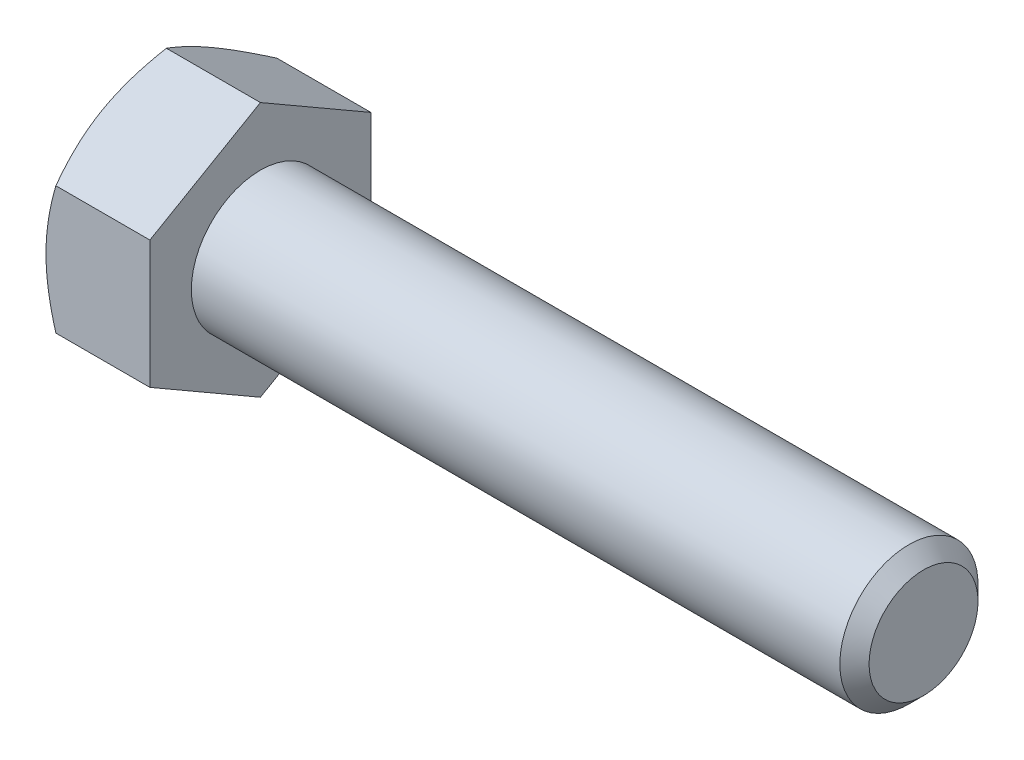
ISO-10303-21;
HEADER;
FILE_DESCRIPTION(('STEP AP214'),'2;1');
FILE_NAME('part.step','',(''),(''),'','','');
FILE_SCHEMA(('AUTOMOTIVE_DESIGN { 1 0 10303 214 1 1 1 1 }'));
ENDSEC;
DATA;
#1=APPLICATION_CONTEXT('core data for automotive mechanical design processes');
#2=APPLICATION_PROTOCOL_DEFINITION('international standard','automotive_design',2000,#1);
#3=PRODUCT_CONTEXT('',#1,'mechanical');
#4=PRODUCT('Part','Part','',(#3));
#5=PRODUCT_RELATED_PRODUCT_CATEGORY('part','',(#4));
#6=PRODUCT_DEFINITION_FORMATION('','',#4);
#7=PRODUCT_DEFINITION_CONTEXT('part definition',#1,'design');
#8=PRODUCT_DEFINITION('design','',#6,#7);
#9=PRODUCT_DEFINITION_SHAPE('','',#8);
#10=(LENGTH_UNIT() NAMED_UNIT(*) SI_UNIT(.MILLI.,.METRE.));
#11=(NAMED_UNIT(*) PLANE_ANGLE_UNIT() SI_UNIT($,.RADIAN.));
#12=(NAMED_UNIT(*) SI_UNIT($,.STERADIAN.) SOLID_ANGLE_UNIT());
#13=UNCERTAINTY_MEASURE_WITH_UNIT(LENGTH_MEASURE(1.E-05),#10,'distance_accuracy_value','');
#14=(GEOMETRIC_REPRESENTATION_CONTEXT(3) GLOBAL_UNCERTAINTY_ASSIGNED_CONTEXT((#13)) GLOBAL_UNIT_ASSIGNED_CONTEXT((#10,
#11,#12)) REPRESENTATION_CONTEXT('',''));
#15=CARTESIAN_POINT('',(0.,0.,0.));
#16=DIRECTION('',(0.,0.,1.));
#17=DIRECTION('',(1.,0.,0.));
#18=AXIS2_PLACEMENT_3D('',#15,#16,#17);
#19=CARTESIAN_POINT('',(5.969,3.66617420935412,-6.35));
#20=DIRECTION('',(0.,-0.866025403784438,0.500000000000001));
#21=DIRECTION('',(0.,-0.500000000000001,-0.866025403784438));
#22=AXIS2_PLACEMENT_3D('',#19,#20,#21);
#23=PLANE('',#22);
#24=CARTESIAN_POINT('',(0.567225792220654,7.33246388876209,0.000200000000000209));
#25=CARTESIAN_POINT('',(0.520705795885484,7.25187715009445,-0.13938032578862));
#26=CARTESIAN_POINT('',(0.476297032585866,7.17098994497989,-0.279481074729295));
#27=CARTESIAN_POINT('',(0.39228345045239,7.00855864282176,-0.560820342806734));
#28=CARTESIAN_POINT('',(0.352680703976118,6.92701427845871,-0.702059324954459));
#29=CARTESIAN_POINT('',(0.241858823809871,6.68107555195827,-1.12803769480199));
#30=CARTESIAN_POINT('',(0.178824482202446,6.51571038378533,-1.41445856787971));
#31=CARTESIAN_POINT('',(0.104909071695574,6.26824441683674,-1.84308219577883));
#32=CARTESIAN_POINT('',(0.0838526679332028,6.18688302502749,-1.98400426016695));
#33=CARTESIAN_POINT('',(0.0485440446617519,6.02379260806586,-2.26648514857209));
#34=CARTESIAN_POINT('',(0.0342912239672212,5.94206361604021,-2.40804391521192));
#35=CARTESIAN_POINT('',(0.012953004278083,5.77846368249352,-2.69140731222966));
#36=CARTESIAN_POINT('',(0.00585947102328989,5.69659300817866,-2.83321147979293));
#37=CARTESIAN_POINT('',(-0.0010156791714816,5.53278054688489,-3.11694298566665));
#38=CARTESIAN_POINT('',(-0.000797521989078706,5.45083876218097,-3.2588703200367));
#39=CARTESIAN_POINT('',(0.0098505765270565,5.22634399461133,-3.64770666350069));
#40=CARTESIAN_POINT('',(0.0277266404085338,5.08386449580427,-3.89448839447147));
#41=CARTESIAN_POINT('',(0.0844122058574266,4.79985183690217,-4.38641274968262));
#42=CARTESIAN_POINT('',(0.123241082865867,4.65831967566048,-4.63155364385826));
#43=CARTESIAN_POINT('',(0.220302170250008,4.37373542545027,-5.12446802425625));
#44=CARTESIAN_POINT('',(0.278945624959318,4.23071924628532,-5.37217931287431));
#45=CARTESIAN_POINT('',(0.412042668710683,3.94681968285054,-5.86390778098996));
#46=CARTESIAN_POINT('',(0.486464993107679,3.80593266266769,-6.10793125807364));
#47=CARTESIAN_POINT('',(0.567225792220648,3.66605873930028,-6.3502));
#48=B_SPLINE_CURVE_WITH_KNOTS('',3,(#24,#25,#26,#27,#28,#29,#30,#31,#32,#33,#34,#35,#36,#37,#38,
#39,#40,#41,#42,#43,#44,#45,#46,#47),.UNSPECIFIED.,.F.,.F.,(4,2,2,2,2,2,2,2,2,2,2,4),(0.,
0.503218195050232,1.00665261286994,2.01561339063536,2.50773694105499,2.99981699787609,
3.49133733019735,3.9828424781586,4.83850206575153,5.69495425638523,6.57040160519865,
7.44413026658513),.UNSPECIFIED.);
#49=CARTESIAN_POINT('',(0.567159123979209,7.33234841870825,0.));
#50=VERTEX_POINT('',#49);
#51=CARTESIAN_POINT('',(0.,5.49926131403118,-3.17500000000001));
#52=VERTEX_POINT('',#51);
#53=EDGE_CURVE('E50',#50,#52,#48,.T.);
#54=ORIENTED_EDGE('',*,*,#53,.F.);
#55=DIRECTION('',(-1.,0.,0.));
#56=VECTOR('',#55,1.);
#57=CARTESIAN_POINT('',(5.969,7.33234841870825,0.));
#58=LINE('',#57,#56);
#59=CARTESIAN_POINT('',(5.969,7.33234841870825,0.));
#60=VERTEX_POINT('',#59);
#61=EDGE_CURVE('E146',#60,#50,#58,.T.);
#62=ORIENTED_EDGE('',*,*,#61,.F.);
#63=DIRECTION('',(0.,0.500000000000001,0.866025403784438));
#64=VECTOR('',#63,1.);
#65=CARTESIAN_POINT('',(5.969,3.66617420935412,-6.35));
#66=LINE('',#65,#64);
#67=CARTESIAN_POINT('',(5.969,3.66617420935412,-6.35));
#68=VERTEX_POINT('',#67);
#69=EDGE_CURVE('E237',#68,#60,#66,.T.);
#70=ORIENTED_EDGE('',*,*,#69,.F.);
#71=DIRECTION('',(-1.,0.,0.));
#72=VECTOR('',#71,1.);
#73=CARTESIAN_POINT('',(5.969,3.66617420935412,-6.35));
#74=LINE('',#73,#72);
#75=CARTESIAN_POINT('',(0.567159123979204,3.66617420935412,-6.35));
#76=VERTEX_POINT('',#75);
#77=EDGE_CURVE('E134',#68,#76,#74,.T.);
#78=ORIENTED_EDGE('',*,*,#77,.T.);
#79=EDGE_CURVE('E128',#52,#76,#48,.T.);
#80=ORIENTED_EDGE('',*,*,#79,.F.);
#81=EDGE_LOOP('',(#54,#62,#70,#78,#80));
#82=FACE_BOUND('',#81,.T.);
#83=ADVANCED_FACE('F34',(#82),#23,.F.);
#84=CARTESIAN_POINT('',(5.969,7.33234841870825,0.));
#85=DIRECTION('',(0.,-0.866025403784438,-0.500000000000001));
#86=DIRECTION('',(0.,0.500000000000001,-0.866025403784438));
#87=AXIS2_PLACEMENT_3D('',#84,#85,#86);
#88=PLANE('',#87);
#89=CARTESIAN_POINT('',(0.56722579222065,3.66605873930028,6.3502));
#90=CARTESIAN_POINT('',(0.520705795885481,3.74664547796792,6.21061967421138));
#91=CARTESIAN_POINT('',(0.476297032585863,3.82753268308249,6.0705189252707));
#92=CARTESIAN_POINT('',(0.392283450452388,3.98996398524061,5.78917965719326));
#93=CARTESIAN_POINT('',(0.352680703976116,4.07150834960367,5.64794067504554));
#94=CARTESIAN_POINT('',(0.24185882380987,4.3174470761041,5.22196230519801));
#95=CARTESIAN_POINT('',(0.178824482202445,4.48281224427705,4.93554143212029));
#96=CARTESIAN_POINT('',(0.104909071695574,4.73027821122563,4.50691780422117));
#97=CARTESIAN_POINT('',(0.0838526679332024,4.81163960303488,4.36599573983305));
#98=CARTESIAN_POINT('',(0.0485440446617518,4.97473001999651,4.08351485142791));
#99=CARTESIAN_POINT('',(0.0342912239672212,5.05645901202216,3.94195608478808));
#100=CARTESIAN_POINT('',(0.0129530042780835,5.22005894556885,3.65859268777034));
#101=CARTESIAN_POINT('',(0.00585947102329078,5.30192961988371,3.51678852020707));
#102=CARTESIAN_POINT('',(-0.00101567917148024,5.46574208117748,3.23305701433335));
#103=CARTESIAN_POINT('',(-0.000797521989077285,5.54768386588139,3.0911296799633));
#104=CARTESIAN_POINT('',(0.00985057652705815,5.77217863345104,2.70229333649931));
#105=CARTESIAN_POINT('',(0.0277266404085357,5.9146581322581,2.45551160552853));
#106=CARTESIAN_POINT('',(0.084412205857429,6.19867079116019,1.96358725031738));
#107=CARTESIAN_POINT('',(0.12324108286587,6.34020295240189,1.71844635614174));
#108=CARTESIAN_POINT('',(0.220302170250012,6.6247872026121,1.22553197574375));
#109=CARTESIAN_POINT('',(0.278945624959322,6.76780338177705,0.977820687125687));
#110=CARTESIAN_POINT('',(0.412042668710687,7.05170294521182,0.486092219010034));
#111=CARTESIAN_POINT('',(0.486464993107684,7.19258996539467,0.242068741926357));
#112=CARTESIAN_POINT('',(0.567225792220653,7.33246388876209,-0.000200000000000381));
#113=B_SPLINE_CURVE_WITH_KNOTS('',3,(#89,#90,#91,#92,#93,#94,#95,#96,#97,#98,#99,#100,#101,#102,
#103,#104,#105,#106,#107,#108,#109,#110,#111,#112),.UNSPECIFIED.,.F.,.F.,(4,2,2,2,2,2,2,2,2,2,2,
4),(0.,0.503218195050233,1.00665261286994,2.01561339063536,2.50773694105499,2.99981699787608,
3.49133733019735,3.9828424781586,4.83850206575152,5.69495425638523,6.57040160519864,
7.44413026658513),.UNSPECIFIED.);
#114=CARTESIAN_POINT('',(0.567159123979205,3.66617420935412,6.35));
#115=VERTEX_POINT('',#114);
#116=CARTESIAN_POINT('',(0.,5.49926131403118,3.175));
#117=VERTEX_POINT('',#116);
#118=EDGE_CURVE('E57',#115,#117,#113,.T.);
#119=ORIENTED_EDGE('',*,*,#118,.F.);
#120=DIRECTION('',(-1.,0.,0.));
#121=VECTOR('',#120,1.);
#122=CARTESIAN_POINT('',(5.969,3.66617420935412,6.35));
#123=LINE('',#122,#121);
#124=CARTESIAN_POINT('',(5.969,3.66617420935412,6.35));
#125=VERTEX_POINT('',#124);
#126=EDGE_CURVE('E144',#125,#115,#123,.T.);
#127=ORIENTED_EDGE('',*,*,#126,.F.);
#128=DIRECTION('',(0.,-0.500000000000001,0.866025403784438));
#129=VECTOR('',#128,1.);
#130=CARTESIAN_POINT('',(5.969,7.33234841870825,0.));
#131=LINE('',#130,#129);
#132=EDGE_CURVE('E235',#60,#125,#131,.T.);
#133=ORIENTED_EDGE('',*,*,#132,.F.);
#134=ORIENTED_EDGE('',*,*,#61,.T.);
#135=EDGE_CURVE('E161',#117,#50,#113,.T.);
#136=ORIENTED_EDGE('',*,*,#135,.F.);
#137=EDGE_LOOP('',(#119,#127,#133,#134,#136));
#138=FACE_BOUND('',#137,.T.);
#139=ADVANCED_FACE('F167',(#138),#88,.F.);
#140=CARTESIAN_POINT('',(5.969,3.66617420935412,6.35));
#141=DIRECTION('',(0.,0.,-1.));
#142=DIRECTION('',(-1.,0.,0.));
#143=AXIS2_PLACEMENT_3D('',#140,#141,#142);
#144=PLANE('',#143);
#145=CARTESIAN_POINT('',(3.14367601755405,-9.9398028319864,6.35));
#146=CARTESIAN_POINT('',(3.00837198029773,-9.66163438687443,6.35));
#147=CARTESIAN_POINT('',(2.87433908027309,-9.38283710730511,6.35));
#148=CARTESIAN_POINT('',(2.60952879037524,-8.82365074911731,6.35));
#149=CARTESIAN_POINT('',(2.4787518963537,-8.54326143593898,6.35));
#150=CARTESIAN_POINT('',(2.22052868772129,-7.97915634696428,6.35));
#151=CARTESIAN_POINT('',(2.09310359186349,-7.695430825227,6.35));
#152=CARTESIAN_POINT('',(1.84334767414879,-7.12575465379769,6.35));
#153=CARTESIAN_POINT('',(1.72101661744909,-6.83980410740554,6.35));
#154=CARTESIAN_POINT('',(1.47885197386771,-6.2557230270762,6.35));
#155=CARTESIAN_POINT('',(1.35923464654653,-5.9575023498181,6.35));
#156=CARTESIAN_POINT('',(1.12883238942456,-5.357606094795,6.35));
#157=CARTESIAN_POINT('',(1.01804843752938,-5.05593013872691,6.35));
#158=CARTESIAN_POINT('',(0.808153098255226,-4.44917964545297,6.35));
#159=CARTESIAN_POINT('',(0.709018875842444,-4.14411308466491,6.35));
#160=CARTESIAN_POINT('',(0.525543834192885,-3.52960171995185,6.35));
#161=CARTESIAN_POINT('',(0.441198453590938,-3.22015829792944,6.35));
#162=CARTESIAN_POINT('',(0.291727586386877,-2.59842911342063,6.35));
#163=CARTESIAN_POINT('',(0.226496888329709,-2.2861690499431,6.35));
#164=CARTESIAN_POINT('',(0.118904571828102,-1.65762730788836,6.35));
#165=CARTESIAN_POINT('',(0.0765405573459597,-1.34134605421932,6.35));
#166=CARTESIAN_POINT('',(0.0329533459299356,-0.86727501688879,6.35));
#167=CARTESIAN_POINT('',(0.0217606490874794,-0.710363798925239,6.35));
#168=CARTESIAN_POINT('',(0.00601970866108338,-0.396201526465927,6.35));
#169=CARTESIAN_POINT('',(0.00147135206033238,-0.238950477796077,6.35));
#170=CARTESIAN_POINT('',(-0.000864873693704551,0.0756024820110096,6.35));
#171=CARTESIAN_POINT('',(0.00134730804231392,0.232904393522198,6.35));
#172=CARTESIAN_POINT('',(0.0124750937047343,0.547273259965608,6.35));
#173=CARTESIAN_POINT('',(0.0213910154873185,0.704340203403035,6.35));
#174=CARTESIAN_POINT('',(0.0504634057547397,1.07899586027898,6.35));
#175=CARTESIAN_POINT('',(0.0736436238822172,1.2963550957377,6.35));
#176=CARTESIAN_POINT('',(0.131599604348194,1.72951065205878,6.35));
#177=CARTESIAN_POINT('',(0.166376861833686,1.94530676772893,6.35));
#178=CARTESIAN_POINT('',(0.286264257854857,2.59006925980297,6.35));
#179=CARTESIAN_POINT('',(0.386910475193507,3.01618787228098,6.35));
#180=CARTESIAN_POINT('',(0.56211678462825,3.65361272982344,6.35));
#181=CARTESIAN_POINT('',(0.625415304913838,3.86820484032541,6.35));
#182=CARTESIAN_POINT('',(0.758751353425599,4.29530575657378,6.35));
#183=CARTESIAN_POINT('',(0.828788931820657,4.50781454679792,6.35));
#184=CARTESIAN_POINT('',(0.974465563814956,4.93081468737568,6.35));
#185=CARTESIAN_POINT('',(1.05010294252176,5.14130661986484,6.35));
#186=CARTESIAN_POINT('',(1.20607264760708,5.56053331579618,6.35));
#187=CARTESIAN_POINT('',(1.28640487799369,5.76926811506532,6.35));
#188=CARTESIAN_POINT('',(1.50347781751132,6.31783828344511,6.35));
#189=CARTESIAN_POINT('',(1.64351404320344,6.65636817400485,6.35));
#190=CARTESIAN_POINT('',(1.93147973510731,7.33006601753897,6.35));
#191=CARTESIAN_POINT('',(2.07940998438119,7.66523363305403,6.35));
#192=CARTESIAN_POINT('',(2.38134633815376,8.33295246114881,6.35));
#193=CARTESIAN_POINT('',(2.53535453751782,8.66550272340177,6.35));
#194=CARTESIAN_POINT('',(2.84803388547348,9.32838207907316,6.35));
#195=CARTESIAN_POINT('',(3.00670486567663,9.65871125217437,6.35));
#196=CARTESIAN_POINT('',(3.32795966755859,10.3180684957328,6.35));
#197=CARTESIAN_POINT('',(3.49054898052716,10.6470938852597,6.35));
#198=CARTESIAN_POINT('',(3.81866781799735,11.3036759425,6.35));
#199=CARTESIAN_POINT('',(3.98419736411603,11.6312325993929,6.35));
#200=CARTESIAN_POINT('',(4.31759864974134,12.2850676249536,6.35));
#201=CARTESIAN_POINT('',(4.485469913239,12.6113462366288,6.35));
#202=CARTESIAN_POINT('',(4.82315890277016,13.2628952011191,6.35));
#203=CARTESIAN_POINT('',(4.99297663652367,13.5881655499287,6.35));
#204=CARTESIAN_POINT('',(5.47018031685674,14.4967378639502,6.35));
#205=CARTESIAN_POINT('',(5.77935148177738,15.0791020152927,6.35));
#206=CARTESIAN_POINT('',(6.40147296847068,16.2418453877031,6.35));
#207=CARTESIAN_POINT('',(6.71442349983112,16.8222244963774,6.35));
#208=CARTESIAN_POINT('',(7.34215184678352,17.9796171047036,6.35));
#209=CARTESIAN_POINT('',(7.65692074956546,18.5566354431591,6.35));
#210=CARTESIAN_POINT('',(8.28862904640648,19.7094283212459,6.35));
#211=CARTESIAN_POINT('',(8.60556827976312,20.2852029489025,6.35));
#212=CARTESIAN_POINT('',(8.92329906980364,20.8605372016132,6.35));
#213=B_SPLINE_CURVE_WITH_KNOTS('',3,(#145,#146,#147,#148,#149,#150,#151,#152,#153,#154,#155,
#156,#157,#158,#159,#160,#161,#162,#163,#164,#165,#166,#167,#168,#169,#170,#171,#172,#173,#174,
#175,#176,#177,#178,#179,#180,#181,#182,#183,#184,#185,#186,#187,#188,#189,#190,#191,#192,#193,
#194,#195,#196,#197,#198,#199,#200,#201,#202,#203,#204,#205,#206,#207,#208,#209,#210,#211,#212),
.UNSPECIFIED.,.F.,.F.,(4,2,2,2,2,2,2,2,2,2,2,2,2,2,2,2,2,2,2,2,2,2,2,2,2,2,2,2,2,2,2,2,2,4),(0.,
0.928000025771649,1.85614052122796,2.78917912474405,3.72217466606164,4.68601414241723,
5.64996017364175,6.61198406033348,7.57371070325733,8.53003982946588,9.48626872926093,
9.95807916799837,10.4298815813894,10.9016875462366,11.3735158830582,12.0289230702765,
12.6844147884824,13.9960635141582,14.6672040909619,15.338349664455,16.0092953039748,
16.6802272299963,17.7791313314936,18.8781446441682,19.9775401158916,21.0768959334804,
22.1778940812193,23.2789003270287,24.379685937715,25.480475915801,27.4584871219283,
29.4366085285952,31.408472007269,33.380191024666),.UNSPECIFIED.);
#214=CARTESIAN_POINT('',(0.567159123979205,-3.66617420935412,6.35));
#215=VERTEX_POINT('',#214);
#216=CARTESIAN_POINT('',(0.,0.,6.35));
#217=VERTEX_POINT('',#216);
#218=EDGE_CURVE('E247',#215,#217,#213,.T.);
#219=ORIENTED_EDGE('',*,*,#218,.F.);
#220=DIRECTION('',(-1.,0.,0.));
#221=VECTOR('',#220,1.);
#222=CARTESIAN_POINT('',(5.969,-3.66617420935412,6.35));
#223=LINE('',#222,#221);
#224=CARTESIAN_POINT('',(5.969,-3.66617420935412,6.35));
#225=VERTEX_POINT('',#224);
#226=EDGE_CURVE('E136',#225,#215,#223,.T.);
#227=ORIENTED_EDGE('',*,*,#226,.F.);
#228=DIRECTION('',(0.,-1.,0.));
#229=VECTOR('',#228,1.);
#230=CARTESIAN_POINT('',(5.969,3.66617420935412,6.35));
#231=LINE('',#230,#229);
#232=EDGE_CURVE('E231',#125,#225,#231,.T.);
#233=ORIENTED_EDGE('',*,*,#232,.F.);
#234=ORIENTED_EDGE('',*,*,#126,.T.);
#235=EDGE_CURVE('E185',#217,#115,#213,.T.);
#236=ORIENTED_EDGE('',*,*,#235,.F.);
#237=EDGE_LOOP('',(#219,#227,#233,#234,#236));
#238=FACE_BOUND('',#237,.T.);
#239=ADVANCED_FACE('F253',(#238),#144,.F.);
#240=CARTESIAN_POINT('',(5.969,-7.33234841870826,0.));
#241=DIRECTION('',(0.,0.866025403784437,-0.500000000000002));
#242=DIRECTION('',(0.,0.500000000000002,0.866025403784438));
#243=AXIS2_PLACEMENT_3D('',#240,#241,#242);
#244=PLANE('',#243);
#245=CARTESIAN_POINT('',(0.56722579222066,-7.3324638887621,-0.000200000000000038));
#246=CARTESIAN_POINT('',(0.520705795885491,-7.25187715009446,0.13938032578862));
#247=CARTESIAN_POINT('',(0.476297032585872,-7.1709899449799,0.279481074729295));
#248=CARTESIAN_POINT('',(0.392283450452396,-7.00855864282177,0.560820342806735));
#249=CARTESIAN_POINT('',(0.352680703976124,-6.92701427845872,0.70205932495446));
#250=CARTESIAN_POINT('',(0.241858823809876,-6.68107555195828,1.12803769480199));
#251=CARTESIAN_POINT('',(0.178824482202451,-6.51571038378533,1.41445856787971));
#252=CARTESIAN_POINT('',(0.104909071695579,-6.26824441683674,1.84308219577883));
#253=CARTESIAN_POINT('',(0.0838526679332076,-6.1868830250275,1.98400426016695));
#254=CARTESIAN_POINT('',(0.0485440446617561,-6.02379260806587,2.26648514857209));
#255=CARTESIAN_POINT('',(0.0342912239672248,-5.94206361604021,2.40804391521192));
#256=CARTESIAN_POINT('',(0.0129530042780867,-5.77846368249353,2.69140731222967));
#257=CARTESIAN_POINT('',(0.00585947102329438,-5.69659300817867,2.83321147979293));
#258=CARTESIAN_POINT('',(-0.00101567917147709,-5.5327805468849,3.11694298566665));
#259=CARTESIAN_POINT('',(-0.000797521989074945,-5.45083876218098,3.2588703200367));
#260=CARTESIAN_POINT('',(0.00985057652705918,-5.22634399461133,3.6477066635007));
#261=CARTESIAN_POINT('',(0.0277266404085369,-5.08386449580427,3.89448839447147));
#262=CARTESIAN_POINT('',(0.08441220585743,-4.79985183690218,4.38641274968263));
#263=CARTESIAN_POINT('',(0.12324108286587,-4.65831967566049,4.63155364385826));
#264=CARTESIAN_POINT('',(0.220302170250011,-4.37373542545027,5.12446802425625));
#265=CARTESIAN_POINT('',(0.278945624959321,-4.23071924628532,5.37217931287431));
#266=CARTESIAN_POINT('',(0.412042668710684,-3.94681968285055,5.86390778098997));
#267=CARTESIAN_POINT('',(0.48646499310768,-3.8059326626677,6.10793125807364));
#268=CARTESIAN_POINT('',(0.56722579222065,-3.66605873930028,6.3502));
#269=B_SPLINE_CURVE_WITH_KNOTS('',3,(#245,#246,#247,#248,#249,#250,#251,#252,#253,#254,#255,
#256,#257,#258,#259,#260,#261,#262,#263,#264,#265,#266,#267,#268),.UNSPECIFIED.,.F.,.F.,(4,2,2,
2,2,2,2,2,2,2,2,4),(0.,0.503218195050233,1.00665261286994,2.01561339063537,2.507736941055,
2.99981699787609,3.49133733019736,3.98284247815861,4.83850206575153,5.69495425638523,
6.57040160519865,7.44413026658513),.UNSPECIFIED.);
#270=CARTESIAN_POINT('',(0.567159123979216,-7.33234841870826,0.));
#271=VERTEX_POINT('',#270);
#272=CARTESIAN_POINT('',(0.,-5.49926131403118,3.17500000000001));
#273=VERTEX_POINT('',#272);
#274=EDGE_CURVE('E169',#271,#273,#269,.T.);
#275=ORIENTED_EDGE('',*,*,#274,.F.);
#276=DIRECTION('',(-1.,0.,0.));
#277=VECTOR('',#276,1.);
#278=CARTESIAN_POINT('',(5.969,-7.33234841870826,0.));
#279=LINE('',#278,#277);
#280=CARTESIAN_POINT('',(5.969,-7.33234841870826,0.));
#281=VERTEX_POINT('',#280);
#282=EDGE_CURVE('E133',#281,#271,#279,.T.);
#283=ORIENTED_EDGE('',*,*,#282,.F.);
#284=DIRECTION('',(0.,-0.500000000000002,-0.866025403784437));
#285=VECTOR('',#284,1.);
#286=CARTESIAN_POINT('',(5.969,-7.33234841870826,0.));
#287=LINE('',#286,#285);
#288=EDGE_CURVE('E229',#225,#281,#287,.T.);
#289=ORIENTED_EDGE('',*,*,#288,.F.);
#290=ORIENTED_EDGE('',*,*,#226,.T.);
#291=EDGE_CURVE('E171',#273,#215,#269,.T.);
#292=ORIENTED_EDGE('',*,*,#291,.F.);
#293=EDGE_LOOP('',(#275,#283,#289,#290,#292));
#294=FACE_BOUND('',#293,.T.);
#295=ADVANCED_FACE('F225',(#294),#244,.F.);
#296=CARTESIAN_POINT('',(5.969,-3.66617420935413,-6.35));
#297=DIRECTION('',(0.,0.866025403784438,0.500000000000001));
#298=DIRECTION('',(0.,-0.500000000000001,0.866025403784438));
#299=AXIS2_PLACEMENT_3D('',#296,#297,#298);
#300=PLANE('',#299);
#301=CARTESIAN_POINT('',(0.567225792220653,-3.66605873930029,-6.3502));
#302=CARTESIAN_POINT('',(0.520705795885484,-3.74664547796793,-6.21061967421138));
#303=CARTESIAN_POINT('',(0.476297032585866,-3.8275326830825,-6.0705189252707));
#304=CARTESIAN_POINT('',(0.392283450452391,-3.98996398524062,-5.78917965719326));
#305=CARTESIAN_POINT('',(0.352680703976119,-4.07150834960368,-5.64794067504554));
#306=CARTESIAN_POINT('',(0.241858823809873,-4.31744707610411,-5.22196230519801));
#307=CARTESIAN_POINT('',(0.17882448220245,-4.48281224427706,-4.93554143212029));
#308=CARTESIAN_POINT('',(0.104909071695578,-4.73027821122565,-4.50691780422117));
#309=CARTESIAN_POINT('',(0.0838526679332068,-4.81163960303489,-4.36599573983304));
#310=CARTESIAN_POINT('',(0.0485440446617562,-4.97473001999652,-4.08351485142791));
#311=CARTESIAN_POINT('',(0.0342912239672257,-5.05645901202218,-3.94195608478808));
#312=CARTESIAN_POINT('',(0.0129530042780883,-5.22005894556886,-3.65859268777033));
#313=CARTESIAN_POINT('',(0.00585947102329567,-5.30192961988372,-3.51678852020707));
#314=CARTESIAN_POINT('',(-0.00101567917147486,-5.46574208117749,-3.23305701433335));
#315=CARTESIAN_POINT('',(-0.000797521989071536,-5.54768386588141,-3.0911296799633));
#316=CARTESIAN_POINT('',(0.0098505765270646,-5.77217863345105,-2.7022933364993));
#317=CARTESIAN_POINT('',(0.0277266404085422,-5.91465813225811,-2.45551160552853));
#318=CARTESIAN_POINT('',(0.0844122058574357,-6.19867079116021,-1.96358725031737));
#319=CARTESIAN_POINT('',(0.123241082865876,-6.3402029524019,-1.71844635614173));
#320=CARTESIAN_POINT('',(0.220302170250019,-6.62478720261212,-1.22553197574375));
#321=CARTESIAN_POINT('',(0.278945624959329,-6.76780338177706,-0.977820687125686));
#322=CARTESIAN_POINT('',(0.412042668710694,-7.05170294521184,-0.486092219010034));
#323=CARTESIAN_POINT('',(0.486464993107691,-7.19258996539468,-0.242068741926357));
#324=CARTESIAN_POINT('',(0.56722579222066,-7.3324638887621,0.000200000000000063));
#325=B_SPLINE_CURVE_WITH_KNOTS('',3,(#301,#302,#303,#304,#305,#306,#307,#308,#309,#310,#311,
#312,#313,#314,#315,#316,#317,#318,#319,#320,#321,#322,#323,#324),.UNSPECIFIED.,.F.,.F.,(4,2,2,
2,2,2,2,2,2,2,2,4),(0.,0.503218195050232,1.00665261286994,2.01561339063536,2.50773694105499,
2.99981699787609,3.49133733019735,3.9828424781586,4.83850206575152,5.69495425638523,
6.57040160519864,7.44413026658513),.UNSPECIFIED.);
#326=CARTESIAN_POINT('',(0.567159123978885,-3.66617420935462,-6.35));
#327=VERTEX_POINT('',#326);
#328=CARTESIAN_POINT('',(0.,-5.49926131403118,-3.175));
#329=VERTEX_POINT('',#328);
#330=EDGE_CURVE('E110',#327,#329,#325,.T.);
#331=ORIENTED_EDGE('',*,*,#330,.F.);
#332=DIRECTION('',(-1.,0.,0.));
#333=VECTOR('',#332,1.);
#334=CARTESIAN_POINT('',(5.969,-3.66617420935413,-6.35));
#335=LINE('',#334,#333);
#336=CARTESIAN_POINT('',(5.969,-3.66617420935413,-6.35));
#337=VERTEX_POINT('',#336);
#338=EDGE_CURVE('E124',#337,#327,#335,.T.);
#339=ORIENTED_EDGE('',*,*,#338,.F.);
#340=DIRECTION('',(0.,0.500000000000001,-0.866025403784438));
#341=VECTOR('',#340,1.);
#342=CARTESIAN_POINT('',(5.969,-3.66617420935413,-6.35));
#343=LINE('',#342,#341);
#344=EDGE_CURVE('E227',#281,#337,#343,.T.);
#345=ORIENTED_EDGE('',*,*,#344,.F.);
#346=ORIENTED_EDGE('',*,*,#282,.T.);
#347=EDGE_CURVE('E127',#329,#271,#325,.T.);
#348=ORIENTED_EDGE('',*,*,#347,.F.);
#349=EDGE_LOOP('',(#331,#339,#345,#346,#348));
#350=FACE_BOUND('',#349,.T.);
#351=ADVANCED_FACE('F122',(#350),#300,.F.);
#352=CARTESIAN_POINT('',(5.969,3.66617420935412,-6.35));
#353=DIRECTION('',(0.,0.,1.));
#354=DIRECTION('',(1.,0.,0.));
#355=AXIS2_PLACEMENT_3D('',#352,#353,#354);
#356=PLANE('',#355);
#357=CARTESIAN_POINT('',(3.14367601755406,-9.93980283198641,-6.35));
#358=CARTESIAN_POINT('',(3.00837198029774,-9.66163438687444,-6.35));
#359=CARTESIAN_POINT('',(2.8743390802731,-9.38283710730512,-6.35));
#360=CARTESIAN_POINT('',(2.60952879037524,-8.82365074911732,-6.35));
#361=CARTESIAN_POINT('',(2.47875189635371,-8.54326143593899,-6.35));
#362=CARTESIAN_POINT('',(2.2205286877213,-7.97915634696429,-6.35));
#363=CARTESIAN_POINT('',(2.0931035918635,-7.69543082522702,-6.35));
#364=CARTESIAN_POINT('',(1.84334767414879,-7.1257546537977,-6.35));
#365=CARTESIAN_POINT('',(1.7210166174491,-6.83980410740555,-6.35));
#366=CARTESIAN_POINT('',(1.47885197386772,-6.25572302707622,-6.35));
#367=CARTESIAN_POINT('',(1.35923464654654,-5.95750234981811,-6.35));
#368=CARTESIAN_POINT('',(1.12883238942456,-5.35760609479502,-6.35));
#369=CARTESIAN_POINT('',(1.01804843752939,-5.05593013872693,-6.35));
#370=CARTESIAN_POINT('',(0.808153098255231,-4.44917964545298,-6.35));
#371=CARTESIAN_POINT('',(0.709018875842448,-4.14411308466493,-6.35));
#372=CARTESIAN_POINT('',(0.525543834192888,-3.52960171995186,-6.35));
#373=CARTESIAN_POINT('',(0.441198453590941,-3.22015829792945,-6.35));
#374=CARTESIAN_POINT('',(0.291727586386879,-2.59842911342064,-6.35));
#375=CARTESIAN_POINT('',(0.226496888329711,-2.28616904994311,-6.35));
#376=CARTESIAN_POINT('',(0.118904571828103,-1.65762730788838,-6.35));
#377=CARTESIAN_POINT('',(0.0765405573459601,-1.34134605421933,-6.35));
#378=CARTESIAN_POINT('',(0.0329533459299353,-0.867275016888799,-6.35));
#379=CARTESIAN_POINT('',(0.021760649087479,-0.710363798925248,-6.35));
#380=CARTESIAN_POINT('',(0.00601970866108289,-0.396201526465936,-6.35));
#381=CARTESIAN_POINT('',(0.00147135206033198,-0.238950477796086,-6.35));
#382=CARTESIAN_POINT('',(-0.000864873693705157,0.0756024820110004,-6.35));
#383=CARTESIAN_POINT('',(0.00134730804231307,0.232904393522189,-6.35));
#384=CARTESIAN_POINT('',(0.0124750937047332,0.5472732599656,-6.35));
#385=CARTESIAN_POINT('',(0.0213910154873172,0.704340203403026,-6.35));
#386=CARTESIAN_POINT('',(0.0504634057547379,1.07899586027897,-6.35));
#387=CARTESIAN_POINT('',(0.0736436238822148,1.29635509573769,-6.35));
#388=CARTESIAN_POINT('',(0.131599604348191,1.72951065205877,-6.35));
#389=CARTESIAN_POINT('',(0.166376861833684,1.94530676772892,-6.35));
#390=CARTESIAN_POINT('',(0.286264257854854,2.59006925980295,-6.35));
#391=CARTESIAN_POINT('',(0.386910475193503,3.01618787228096,-6.35));
#392=CARTESIAN_POINT('',(0.562116784628246,3.65361272982343,-6.35));
#393=CARTESIAN_POINT('',(0.625415304913833,3.8682048403254,-6.35));
#394=CARTESIAN_POINT('',(0.758751353425594,4.29530575657376,-6.35));
#395=CARTESIAN_POINT('',(0.828788931820652,4.50781454679791,-6.35));
#396=CARTESIAN_POINT('',(0.974465563814951,4.93081468737566,-6.35));
#397=CARTESIAN_POINT('',(1.05010294252175,5.14130661986482,-6.35));
#398=CARTESIAN_POINT('',(1.20607264760708,5.56053331579616,-6.35));
#399=CARTESIAN_POINT('',(1.28640487799369,5.7692681150653,-6.35));
#400=CARTESIAN_POINT('',(1.50347781751131,6.31783828344509,-6.35));
#401=CARTESIAN_POINT('',(1.64351404320344,6.65636817400483,-6.35));
#402=CARTESIAN_POINT('',(1.9314797351073,7.33006601753895,-6.35));
#403=CARTESIAN_POINT('',(2.07940998438118,7.66523363305401,-6.35));
#404=CARTESIAN_POINT('',(2.38134633815376,8.3329524611488,-6.35));
#405=CARTESIAN_POINT('',(2.53535453751782,8.66550272340175,-6.35));
#406=CARTESIAN_POINT('',(2.84803388547347,9.32838207907314,-6.35));
#407=CARTESIAN_POINT('',(3.00670486567662,9.65871125217435,-6.35));
#408=CARTESIAN_POINT('',(3.32795966755858,10.3180684957328,-6.35));
#409=CARTESIAN_POINT('',(3.49054898052716,10.6470938852597,-6.35));
#410=CARTESIAN_POINT('',(3.81866781799734,11.3036759425,-6.35));
#411=CARTESIAN_POINT('',(3.98419736411603,11.6312325993928,-6.35));
#412=CARTESIAN_POINT('',(4.31759864974134,12.2850676249535,-6.35));
#413=CARTESIAN_POINT('',(4.485469913239,12.6113462366288,-6.35));
#414=CARTESIAN_POINT('',(4.82315890277016,13.2628952011191,-6.35));
#415=CARTESIAN_POINT('',(4.99297663652367,13.5881655499287,-6.35));
#416=CARTESIAN_POINT('',(5.47018031685674,14.4967378639502,-6.35));
#417=CARTESIAN_POINT('',(5.77935148177737,15.0791020152927,-6.35));
#418=CARTESIAN_POINT('',(6.40147296847068,16.2418453877031,-6.35));
#419=CARTESIAN_POINT('',(6.71442349983111,16.8222244963774,-6.35));
#420=CARTESIAN_POINT('',(7.34215184678352,17.9796171047036,-6.35));
#421=CARTESIAN_POINT('',(7.65692074956546,18.5566354431591,-6.35));
#422=CARTESIAN_POINT('',(8.28862904640648,19.7094283212459,-6.35));
#423=CARTESIAN_POINT('',(8.60556827976312,20.2852029489025,-6.35));
#424=CARTESIAN_POINT('',(8.92329906980364,20.8605372016132,-6.35));
#425=B_SPLINE_CURVE_WITH_KNOTS('',3,(#357,#358,#359,#360,#361,#362,#363,#364,#365,#366,#367,
#368,#369,#370,#371,#372,#373,#374,#375,#376,#377,#378,#379,#380,#381,#382,#383,#384,#385,#386,
#387,#388,#389,#390,#391,#392,#393,#394,#395,#396,#397,#398,#399,#400,#401,#402,#403,#404,#405,
#406,#407,#408,#409,#410,#411,#412,#413,#414,#415,#416,#417,#418,#419,#420,#421,#422,#423,#424),
.UNSPECIFIED.,.F.,.F.,(4,2,2,2,2,2,2,2,2,2,2,2,2,2,2,2,2,2,2,2,2,2,2,2,2,2,2,2,2,2,2,2,2,4),(0.,
0.928000025771649,1.85614052122796,2.78917912474405,3.72217466606164,4.68601414241723,
5.64996017364175,6.61198406033348,7.57371070325734,8.53003982946588,9.48626872926093,
9.95807916799838,10.4298815813894,10.9016875462366,11.3735158830582,12.0289230702765,
12.6844147884824,13.9960635141582,14.6672040909619,15.338349664455,16.0092953039748,
16.6802272299963,17.7791313314936,18.8781446441682,19.9775401158916,21.0768959334804,
22.1778940812193,23.2789003270287,24.379685937715,25.480475915801,27.4584871219283,
29.4366085285952,31.408472007269,33.380191024666),.UNSPECIFIED.);
#426=CARTESIAN_POINT('',(0.,0.,-6.35));
#427=VERTEX_POINT('',#426);
#428=EDGE_CURVE('E116',#76,#427,#425,.F.);
#429=ORIENTED_EDGE('',*,*,#428,.F.);
#430=ORIENTED_EDGE('',*,*,#77,.F.);
#431=DIRECTION('',(0.,1.,0.));
#432=VECTOR('',#431,1.);
#433=CARTESIAN_POINT('',(5.969,3.66617420935412,-6.35));
#434=LINE('',#433,#432);
#435=EDGE_CURVE('E132',#337,#68,#434,.T.);
#436=ORIENTED_EDGE('',*,*,#435,.F.);
#437=ORIENTED_EDGE('',*,*,#338,.T.);
#438=EDGE_CURVE('E107',#427,#327,#425,.F.);
#439=ORIENTED_EDGE('',*,*,#438,.F.);
#440=EDGE_LOOP('',(#429,#430,#436,#437,#439));
#441=FACE_BOUND('',#440,.T.);
#442=ADVANCED_FACE('F130',(#441),#356,.F.);
#443=CARTESIAN_POINT('',(5.969,7.33234841870825,0.));
#444=DIRECTION('',(1.,0.,0.));
#445=DIRECTION('',(0.,0.,-1.));
#446=AXIS2_PLACEMENT_3D('',#443,#444,#445);
#447=PLANE('',#446);
#448=CARTESIAN_POINT('',(5.969,0.,0.));
#449=DIRECTION('',(1.,0.,0.));
#450=DIRECTION('',(0.,0.,-1.));
#451=AXIS2_PLACEMENT_3D('',#448,#449,#450);
#452=CIRCLE('',#451,3.96875);
#453=CARTESIAN_POINT('',(5.969,0.,-3.96875));
#454=VERTEX_POINT('',#453);
#455=EDGE_CURVE('E240',#454,#454,#452,.F.);
#456=ORIENTED_EDGE('',*,*,#455,.T.);
#457=EDGE_LOOP('',(#456));
#458=FACE_BOUND('',#457,.T.);
#459=ORIENTED_EDGE('',*,*,#69,.T.);
#460=ORIENTED_EDGE('',*,*,#132,.T.);
#461=ORIENTED_EDGE('',*,*,#232,.T.);
#462=ORIENTED_EDGE('',*,*,#288,.T.);
#463=ORIENTED_EDGE('',*,*,#344,.T.);
#464=ORIENTED_EDGE('',*,*,#435,.T.);
#465=EDGE_LOOP('',(#459,#460,#461,#462,#463,#464));
#466=FACE_BOUND('',#465,.T.);
#467=ADVANCED_FACE('F255',(#458,#466),#447,.T.);
#468=CARTESIAN_POINT('',(0.,0.,0.));
#469=DIRECTION('',(-1.,0.,0.));
#470=DIRECTION('',(0.,0.,1.));
#471=AXIS2_PLACEMENT_3D('',#468,#469,#470);
#472=CYLINDRICAL_SURFACE('',#471,3.96875);
#473=ORIENTED_EDGE('',*,*,#455,.F.);
#474=EDGE_LOOP('',(#473));
#475=FACE_BOUND('',#474,.T.);
#476=CARTESIAN_POINT('',(43.22953,0.,0.));
#477=DIRECTION('',(-1.,0.,0.));
#478=DIRECTION('',(0.,0.,1.));
#479=AXIS2_PLACEMENT_3D('',#476,#477,#478);
#480=CIRCLE('',#479,3.96875);
#481=CARTESIAN_POINT('',(43.22953,0.,3.96875));
#482=VERTEX_POINT('',#481);
#483=EDGE_CURVE('E243',#482,#482,#480,.T.);
#484=ORIENTED_EDGE('',*,*,#483,.T.);
#485=EDGE_LOOP('',(#484));
#486=FACE_BOUND('',#485,.T.);
#487=ADVANCED_FACE('F286',(#475,#486),#472,.T.);
#488=CARTESIAN_POINT('',(44.069,0.,0.));
#489=DIRECTION('',(-1.,0.,0.));
#490=DIRECTION('',(0.,0.,1.));
#491=AXIS2_PLACEMENT_3D('',#488,#489,#490);
#492=CONICAL_SURFACE('',#491,3.12928,0.785398163397435);
#493=ORIENTED_EDGE('',*,*,#483,.F.);
#494=EDGE_LOOP('',(#493));
#495=FACE_BOUND('',#494,.T.);
#496=CARTESIAN_POINT('',(44.069,0.,0.));
#497=DIRECTION('',(-1.,0.,0.));
#498=DIRECTION('',(0.,0.,1.));
#499=AXIS2_PLACEMENT_3D('',#496,#497,#498);
#500=CIRCLE('',#499,3.12928);
#501=CARTESIAN_POINT('',(44.069,0.,3.12928));
#502=VERTEX_POINT('',#501);
#503=EDGE_CURVE('E245',#502,#502,#500,.T.);
#504=ORIENTED_EDGE('',*,*,#503,.T.);
#505=EDGE_LOOP('',(#504));
#506=FACE_BOUND('',#505,.T.);
#507=ADVANCED_FACE('F289',(#495,#506),#492,.T.);
#508=CARTESIAN_POINT('',(44.069,0.,0.));
#509=DIRECTION('',(-1.,0.,0.));
#510=DIRECTION('',(0.,0.,1.));
#511=AXIS2_PLACEMENT_3D('',#508,#509,#510);
#512=PLANE('',#511);
#513=ORIENTED_EDGE('',*,*,#503,.F.);
#514=EDGE_LOOP('',(#513));
#515=FACE_BOUND('',#514,.T.);
#516=ADVANCED_FACE('F199',(#515),#512,.F.);
#517=CARTESIAN_POINT('',(0.,0.,0.));
#518=DIRECTION('',(1.,0.,0.));
#519=DIRECTION('',(0.,0.,-1.));
#520=AXIS2_PLACEMENT_3D('',#517,#518,#519);
#521=CONICAL_SURFACE('',#520,6.35,1.0471975511966);
#522=ORIENTED_EDGE('',*,*,#330,.T.);
#523=CARTESIAN_POINT('',(0.,0.,0.));
#524=DIRECTION('',(1.,0.,0.));
#525=DIRECTION('',(0.,0.,-1.));
#526=AXIS2_PLACEMENT_3D('',#523,#524,#525);
#527=CIRCLE('',#526,6.35);
#528=EDGE_CURVE('E38',#329,#427,#527,.T.);
#529=ORIENTED_EDGE('',*,*,#528,.T.);
#530=ORIENTED_EDGE('',*,*,#438,.T.);
#531=EDGE_LOOP('',(#522,#529,#530));
#532=FACE_BOUND('',#531,.T.);
#533=ADVANCED_FACE('F109',(#532),#521,.T.);
#534=ORIENTED_EDGE('',*,*,#274,.T.);
#535=EDGE_CURVE('E151',#273,#329,#527,.T.);
#536=ORIENTED_EDGE('',*,*,#535,.T.);
#537=ORIENTED_EDGE('',*,*,#347,.T.);
#538=EDGE_LOOP('',(#534,#536,#537));
#539=FACE_BOUND('',#538,.T.);
#540=ADVANCED_FACE('F198',(#539),#521,.T.);
#541=ORIENTED_EDGE('',*,*,#218,.T.);
#542=EDGE_CURVE('E152',#217,#273,#527,.T.);
#543=ORIENTED_EDGE('',*,*,#542,.T.);
#544=ORIENTED_EDGE('',*,*,#291,.T.);
#545=EDGE_LOOP('',(#541,#543,#544));
#546=FACE_BOUND('',#545,.T.);
#547=ADVANCED_FACE('F193',(#546),#521,.T.);
#548=ORIENTED_EDGE('',*,*,#235,.T.);
#549=ORIENTED_EDGE('',*,*,#118,.T.);
#550=CARTESIAN_POINT('',(0.,0.,0.));
#551=DIRECTION('',(-1.,0.,0.));
#552=DIRECTION('',(0.,0.,1.));
#553=AXIS2_PLACEMENT_3D('',#550,#551,#552);
#554=CIRCLE('',#553,6.35);
#555=EDGE_CURVE('E117',#217,#117,#554,.T.);
#556=ORIENTED_EDGE('',*,*,#555,.F.);
#557=EDGE_LOOP('',(#548,#549,#556));
#558=FACE_BOUND('',#557,.T.);
#559=ADVANCED_FACE('F197',(#558),#521,.T.);
#560=ORIENTED_EDGE('',*,*,#135,.T.);
#561=ORIENTED_EDGE('',*,*,#53,.T.);
#562=EDGE_CURVE('E43',#52,#117,#527,.T.);
#563=ORIENTED_EDGE('',*,*,#562,.T.);
#564=EDGE_LOOP('',(#560,#561,#563));
#565=FACE_BOUND('',#564,.T.);
#566=ADVANCED_FACE('F160',(#565),#521,.T.);
#567=ORIENTED_EDGE('',*,*,#79,.T.);
#568=ORIENTED_EDGE('',*,*,#428,.T.);
#569=EDGE_CURVE('E11',#427,#52,#527,.T.);
#570=ORIENTED_EDGE('',*,*,#569,.T.);
#571=EDGE_LOOP('',(#567,#568,#570));
#572=FACE_BOUND('',#571,.T.);
#573=ADVANCED_FACE('F258',(#572),#521,.T.);
#574=CARTESIAN_POINT('',(0.,7.33234841870825,0.));
#575=DIRECTION('',(1.,0.,0.));
#576=DIRECTION('',(0.,0.,-1.));
#577=AXIS2_PLACEMENT_3D('',#574,#575,#576);
#578=PLANE('',#577);
#579=ORIENTED_EDGE('',*,*,#569,.F.);
#580=ORIENTED_EDGE('',*,*,#528,.F.);
#581=ORIENTED_EDGE('',*,*,#535,.F.);
#582=ORIENTED_EDGE('',*,*,#542,.F.);
#583=ORIENTED_EDGE('',*,*,#555,.T.);
#584=ORIENTED_EDGE('',*,*,#562,.F.);
#585=EDGE_LOOP('',(#579,#580,#581,#582,#583,#584));
#586=FACE_BOUND('',#585,.T.);
#587=ADVANCED_FACE('F164',(#586),#578,.F.);
#588=CLOSED_SHELL('',(#83,#139,#239,#295,#351,#442,#467,#487,#507,#516,#533,#540,#547,#559,#566,
#573,#587));
#589=MANIFOLD_SOLID_BREP('B2',#588);
#590=ADVANCED_BREP_SHAPE_REPRESENTATION('',(#18,#589),#14);
#591=SHAPE_DEFINITION_REPRESENTATION(#9,#590);
ENDSEC;
END-ISO-10303-21;
